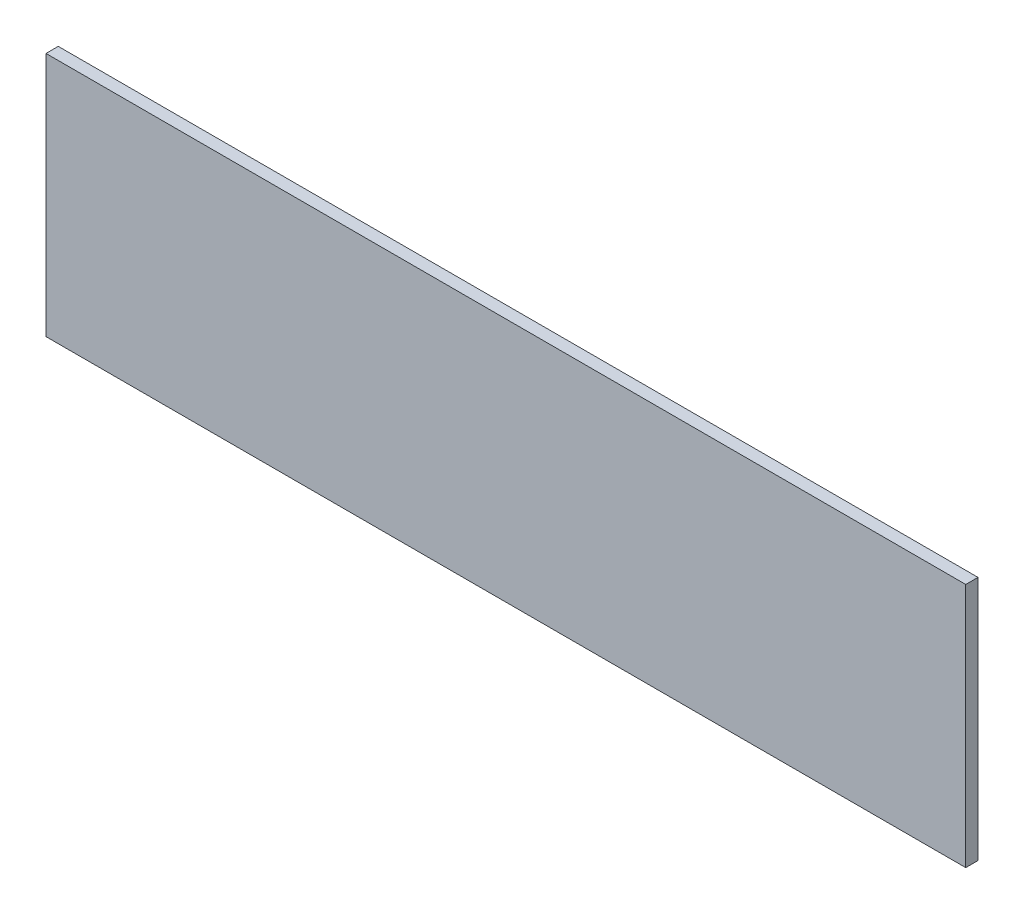
ISO-10303-21;
HEADER;
FILE_DESCRIPTION(('STEP AP214'),'2;1');
FILE_NAME('part.step','',(''),(''),'','','');
FILE_SCHEMA(('AUTOMOTIVE_DESIGN { 1 0 10303 214 1 1 1 1 }'));
ENDSEC;
DATA;
#1=APPLICATION_CONTEXT('core data for automotive mechanical design processes');
#2=APPLICATION_PROTOCOL_DEFINITION('international standard','automotive_design',2000,#1);
#3=PRODUCT_CONTEXT('',#1,'mechanical');
#4=PRODUCT('Part','Part','',(#3));
#5=PRODUCT_RELATED_PRODUCT_CATEGORY('part','',(#4));
#6=PRODUCT_DEFINITION_FORMATION('','',#4);
#7=PRODUCT_DEFINITION_CONTEXT('part definition',#1,'design');
#8=PRODUCT_DEFINITION('design','',#6,#7);
#9=PRODUCT_DEFINITION_SHAPE('','',#8);
#10=(LENGTH_UNIT() NAMED_UNIT(*) SI_UNIT(.MILLI.,.METRE.));
#11=(NAMED_UNIT(*) PLANE_ANGLE_UNIT() SI_UNIT($,.RADIAN.));
#12=(NAMED_UNIT(*) SI_UNIT($,.STERADIAN.) SOLID_ANGLE_UNIT());
#13=UNCERTAINTY_MEASURE_WITH_UNIT(LENGTH_MEASURE(1.E-05),#10,'distance_accuracy_value','');
#14=(GEOMETRIC_REPRESENTATION_CONTEXT(3) GLOBAL_UNCERTAINTY_ASSIGNED_CONTEXT((#13)) GLOBAL_UNIT_ASSIGNED_CONTEXT((#10,
#11,#12)) REPRESENTATION_CONTEXT('',''));
#15=CARTESIAN_POINT('',(0.,0.,0.));
#16=DIRECTION('',(0.,0.,1.));
#17=DIRECTION('',(1.,0.,0.));
#18=AXIS2_PLACEMENT_3D('',#15,#16,#17);
#19=CARTESIAN_POINT('',(0.,0.,4.));
#20=DIRECTION('',(1.,0.,0.));
#21=DIRECTION('',(0.,0.,-1.));
#22=AXIS2_PLACEMENT_3D('',#19,#20,#21);
#23=PLANE('',#22);
#24=DIRECTION('',(0.,-1.,0.));
#25=VECTOR('',#24,1.);
#26=CARTESIAN_POINT('',(0.,0.,0.));
#27=LINE('',#26,#25);
#28=CARTESIAN_POINT('',(0.,80.,0.));
#29=VERTEX_POINT('',#28);
#30=CARTESIAN_POINT('',(0.,0.,0.));
#31=VERTEX_POINT('',#30);
#32=EDGE_CURVE('E113',#29,#31,#27,.T.);
#33=ORIENTED_EDGE('',*,*,#32,.T.);
#34=DIRECTION('',(0.,0.,-1.));
#35=VECTOR('',#34,1.);
#36=CARTESIAN_POINT('',(0.,0.,4.));
#37=LINE('',#36,#35);
#38=CARTESIAN_POINT('',(0.,0.,4.));
#39=VERTEX_POINT('',#38);
#40=EDGE_CURVE('E11',#39,#31,#37,.T.);
#41=ORIENTED_EDGE('',*,*,#40,.F.);
#42=DIRECTION('',(0.,-1.,0.));
#43=VECTOR('',#42,1.);
#44=CARTESIAN_POINT('',(0.,0.,4.));
#45=LINE('',#44,#43);
#46=CARTESIAN_POINT('',(0.,80.,4.));
#47=VERTEX_POINT('',#46);
#48=EDGE_CURVE('E97',#47,#39,#45,.T.);
#49=ORIENTED_EDGE('',*,*,#48,.F.);
#50=DIRECTION('',(0.,0.,-1.));
#51=VECTOR('',#50,1.);
#52=CARTESIAN_POINT('',(0.,80.,4.));
#53=LINE('',#52,#51);
#54=EDGE_CURVE('E109',#47,#29,#53,.T.);
#55=ORIENTED_EDGE('',*,*,#54,.T.);
#56=EDGE_LOOP('',(#33,#41,#49,#55));
#57=FACE_BOUND('',#56,.T.);
#58=ADVANCED_FACE('F45',(#57),#23,.F.);
#59=CARTESIAN_POINT('',(0.,0.,4.));
#60=DIRECTION('',(0.,1.,0.));
#61=DIRECTION('',(0.,0.,1.));
#62=AXIS2_PLACEMENT_3D('',#59,#60,#61);
#63=PLANE('',#62);
#64=DIRECTION('',(1.,0.,0.));
#65=VECTOR('',#64,1.);
#66=CARTESIAN_POINT('',(0.,0.,0.));
#67=LINE('',#66,#65);
#68=CARTESIAN_POINT('',(300.,0.,0.));
#69=VERTEX_POINT('',#68);
#70=EDGE_CURVE('E102',#31,#69,#67,.T.);
#71=ORIENTED_EDGE('',*,*,#70,.T.);
#72=DIRECTION('',(0.,0.,-1.));
#73=VECTOR('',#72,1.);
#74=CARTESIAN_POINT('',(300.,0.,4.));
#75=LINE('',#74,#73);
#76=CARTESIAN_POINT('',(300.,0.,4.));
#77=VERTEX_POINT('',#76);
#78=EDGE_CURVE('E54',#77,#69,#75,.T.);
#79=ORIENTED_EDGE('',*,*,#78,.F.);
#80=DIRECTION('',(1.,0.,0.));
#81=VECTOR('',#80,1.);
#82=CARTESIAN_POINT('',(0.,0.,4.));
#83=LINE('',#82,#81);
#84=EDGE_CURVE('E92',#39,#77,#83,.T.);
#85=ORIENTED_EDGE('',*,*,#84,.F.);
#86=ORIENTED_EDGE('',*,*,#40,.T.);
#87=EDGE_LOOP('',(#71,#79,#85,#86));
#88=FACE_BOUND('',#87,.T.);
#89=ADVANCED_FACE('F101',(#88),#63,.F.);
#90=CARTESIAN_POINT('',(300.,0.,4.));
#91=DIRECTION('',(-1.,0.,0.));
#92=DIRECTION('',(0.,0.,1.));
#93=AXIS2_PLACEMENT_3D('',#90,#91,#92);
#94=PLANE('',#93);
#95=DIRECTION('',(0.,1.,0.));
#96=VECTOR('',#95,1.);
#97=CARTESIAN_POINT('',(300.,0.,0.));
#98=LINE('',#97,#96);
#99=CARTESIAN_POINT('',(300.,80.,0.));
#100=VERTEX_POINT('',#99);
#101=EDGE_CURVE('E79',#69,#100,#98,.T.);
#102=ORIENTED_EDGE('',*,*,#101,.T.);
#103=DIRECTION('',(0.,0.,-1.));
#104=VECTOR('',#103,1.);
#105=CARTESIAN_POINT('',(300.,80.,4.));
#106=LINE('',#105,#104);
#107=CARTESIAN_POINT('',(300.,80.,4.));
#108=VERTEX_POINT('',#107);
#109=EDGE_CURVE('E104',#108,#100,#106,.T.);
#110=ORIENTED_EDGE('',*,*,#109,.F.);
#111=DIRECTION('',(0.,1.,0.));
#112=VECTOR('',#111,1.);
#113=CARTESIAN_POINT('',(300.,0.,4.));
#114=LINE('',#113,#112);
#115=EDGE_CURVE('E95',#77,#108,#114,.T.);
#116=ORIENTED_EDGE('',*,*,#115,.F.);
#117=ORIENTED_EDGE('',*,*,#78,.T.);
#118=EDGE_LOOP('',(#102,#110,#116,#117));
#119=FACE_BOUND('',#118,.T.);
#120=ADVANCED_FACE('F105',(#119),#94,.F.);
#121=CARTESIAN_POINT('',(0.,80.,4.));
#122=DIRECTION('',(0.,-1.,0.));
#123=DIRECTION('',(0.,0.,-1.));
#124=AXIS2_PLACEMENT_3D('',#121,#122,#123);
#125=PLANE('',#124);
#126=DIRECTION('',(-1.,0.,0.));
#127=VECTOR('',#126,1.);
#128=CARTESIAN_POINT('',(0.,80.,0.));
#129=LINE('',#128,#127);
#130=EDGE_CURVE('E85',#100,#29,#129,.T.);
#131=ORIENTED_EDGE('',*,*,#130,.T.);
#132=ORIENTED_EDGE('',*,*,#54,.F.);
#133=DIRECTION('',(-1.,0.,0.));
#134=VECTOR('',#133,1.);
#135=CARTESIAN_POINT('',(0.,80.,4.));
#136=LINE('',#135,#134);
#137=EDGE_CURVE('E62',#108,#47,#136,.T.);
#138=ORIENTED_EDGE('',*,*,#137,.F.);
#139=ORIENTED_EDGE('',*,*,#109,.T.);
#140=EDGE_LOOP('',(#131,#132,#138,#139));
#141=FACE_BOUND('',#140,.T.);
#142=ADVANCED_FACE('F126',(#141),#125,.F.);
#143=CARTESIAN_POINT('',(0.,0.,4.));
#144=DIRECTION('',(0.,0.,-1.));
#145=DIRECTION('',(-1.,0.,0.));
#146=AXIS2_PLACEMENT_3D('',#143,#144,#145);
#147=PLANE('',#146);
#148=ORIENTED_EDGE('',*,*,#48,.T.);
#149=ORIENTED_EDGE('',*,*,#84,.T.);
#150=ORIENTED_EDGE('',*,*,#115,.T.);
#151=ORIENTED_EDGE('',*,*,#137,.T.);
#152=EDGE_LOOP('',(#148,#149,#150,#151));
#153=FACE_BOUND('',#152,.T.);
#154=ADVANCED_FACE('F93',(#153),#147,.F.);
#155=CARTESIAN_POINT('',(0.,0.,0.));
#156=DIRECTION('',(0.,0.,-1.));
#157=DIRECTION('',(-1.,0.,0.));
#158=AXIS2_PLACEMENT_3D('',#155,#156,#157);
#159=PLANE('',#158);
#160=ORIENTED_EDGE('',*,*,#32,.F.);
#161=ORIENTED_EDGE('',*,*,#130,.F.);
#162=ORIENTED_EDGE('',*,*,#101,.F.);
#163=ORIENTED_EDGE('',*,*,#70,.F.);
#164=EDGE_LOOP('',(#160,#161,#162,#163));
#165=FACE_BOUND('',#164,.T.);
#166=ADVANCED_FACE('F129',(#165),#159,.T.);
#167=CLOSED_SHELL('',(#58,#89,#120,#142,#154,#166));
#168=MANIFOLD_SOLID_BREP('B2',#167);
#169=ADVANCED_BREP_SHAPE_REPRESENTATION('',(#18,#168),#14);
#170=SHAPE_DEFINITION_REPRESENTATION(#9,#169);
ENDSEC;
END-ISO-10303-21;
